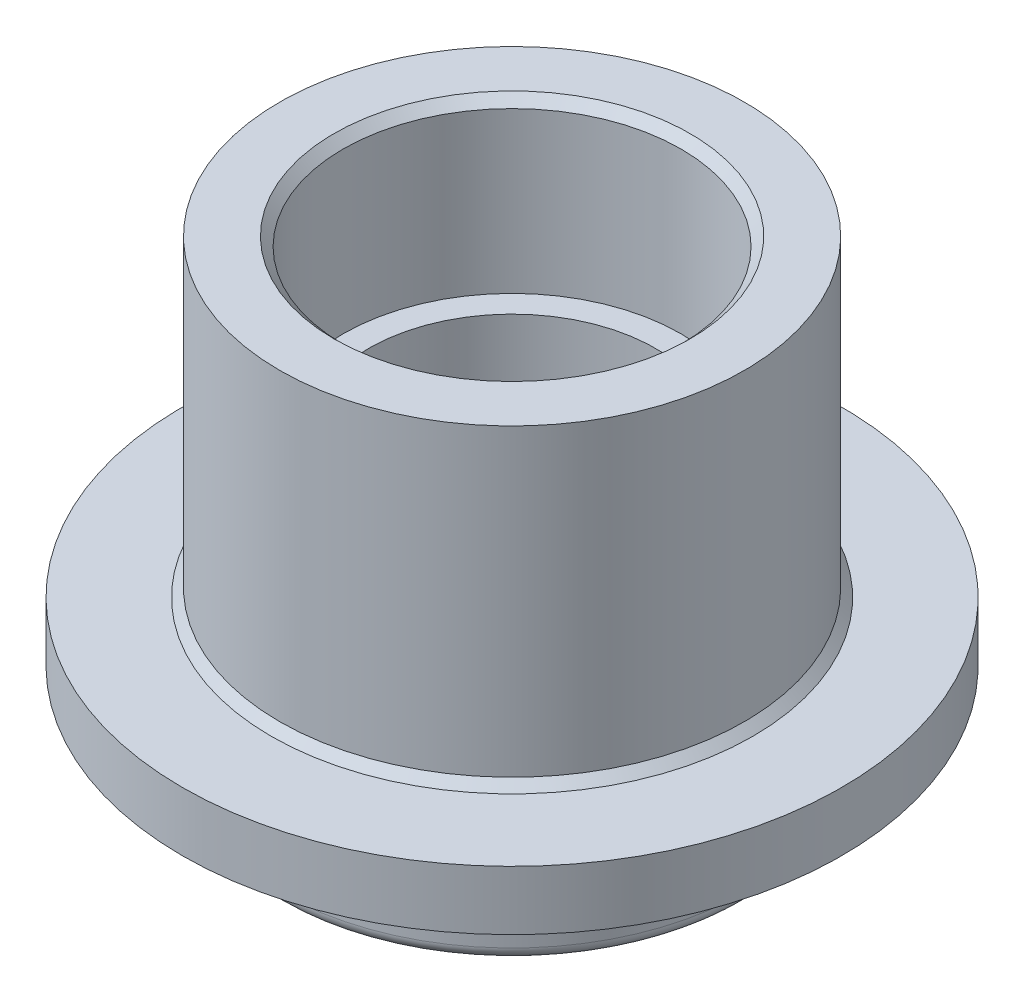
ISO-10303-21;
HEADER;
FILE_DESCRIPTION(('STEP AP214'),'2;1');
FILE_NAME('part.step','',(''),(''),'','','');
FILE_SCHEMA(('AUTOMOTIVE_DESIGN { 1 0 10303 214 1 1 1 1 }'));
ENDSEC;
DATA;
#1=APPLICATION_CONTEXT('core data for automotive mechanical design processes');
#2=APPLICATION_PROTOCOL_DEFINITION('international standard','automotive_design',2000,#1);
#3=PRODUCT_CONTEXT('',#1,'mechanical');
#4=PRODUCT('Part','Part','',(#3));
#5=PRODUCT_RELATED_PRODUCT_CATEGORY('part','',(#4));
#6=PRODUCT_DEFINITION_FORMATION('','',#4);
#7=PRODUCT_DEFINITION_CONTEXT('part definition',#1,'design');
#8=PRODUCT_DEFINITION('design','',#6,#7);
#9=PRODUCT_DEFINITION_SHAPE('','',#8);
#10=(LENGTH_UNIT() NAMED_UNIT(*) SI_UNIT(.MILLI.,.METRE.));
#11=(NAMED_UNIT(*) PLANE_ANGLE_UNIT() SI_UNIT($,.RADIAN.));
#12=(NAMED_UNIT(*) SI_UNIT($,.STERADIAN.) SOLID_ANGLE_UNIT());
#13=UNCERTAINTY_MEASURE_WITH_UNIT(LENGTH_MEASURE(1.E-05),#10,'distance_accuracy_value','');
#14=(GEOMETRIC_REPRESENTATION_CONTEXT(3) GLOBAL_UNCERTAINTY_ASSIGNED_CONTEXT((#13)) GLOBAL_UNIT_ASSIGNED_CONTEXT((#10,
#11,#12)) REPRESENTATION_CONTEXT('',''));
#15=CARTESIAN_POINT('',(0.,0.,0.));
#16=DIRECTION('',(0.,0.,1.));
#17=DIRECTION('',(1.,0.,0.));
#18=AXIS2_PLACEMENT_3D('',#15,#16,#17);
#19=CARTESIAN_POINT('',(0.,-180.,0.));
#20=DIRECTION('',(0.,1.,0.));
#21=DIRECTION('',(0.,0.,1.));
#22=AXIS2_PLACEMENT_3D('',#19,#20,#21);
#23=PLANE('',#22);
#24=CARTESIAN_POINT('',(0.,-180.,0.));
#25=DIRECTION('',(0.,1.,0.));
#26=DIRECTION('',(0.,0.,1.));
#27=AXIS2_PLACEMENT_3D('',#24,#25,#26);
#28=CIRCLE('',#27,260.);
#29=CARTESIAN_POINT('',(0.,-180.,260.));
#30=VERTEX_POINT('',#29);
#31=EDGE_CURVE('E10',#30,#30,#28,.T.);
#32=ORIENTED_EDGE('',*,*,#31,.F.);
#33=EDGE_LOOP('',(#32));
#34=FACE_BOUND('',#33,.T.);
#35=CARTESIAN_POINT('',(0.,-180.,0.));
#36=DIRECTION('',(0.,1.,0.));
#37=DIRECTION('',(0.,0.,1.));
#38=AXIS2_PLACEMENT_3D('',#35,#36,#37);
#39=CIRCLE('',#38,200.);
#40=CARTESIAN_POINT('',(0.,-180.,200.));
#41=VERTEX_POINT('',#40);
#42=EDGE_CURVE('E85',#41,#41,#39,.T.);
#43=ORIENTED_EDGE('',*,*,#42,.T.);
#44=EDGE_LOOP('',(#43));
#45=FACE_BOUND('',#44,.T.);
#46=ADVANCED_FACE('F36',(#34,#45),#23,.F.);
#47=CARTESIAN_POINT('',(0.,-165.,0.));
#48=DIRECTION('',(0.,1.,0.));
#49=DIRECTION('',(0.,0.,1.));
#50=AXIS2_PLACEMENT_3D('',#47,#48,#49);
#51=TOROIDAL_SURFACE('',#50,260.,15.);
#52=CARTESIAN_POINT('',(0.,-165.,0.));
#53=DIRECTION('',(0.,1.,0.));
#54=DIRECTION('',(0.,0.,1.));
#55=AXIS2_PLACEMENT_3D('',#52,#53,#54);
#56=CIRCLE('',#55,275.);
#57=CARTESIAN_POINT('',(0.,-165.,275.));
#58=VERTEX_POINT('',#57);
#59=EDGE_CURVE('E42',#58,#58,#56,.T.);
#60=ORIENTED_EDGE('',*,*,#59,.F.);
#61=EDGE_LOOP('',(#60));
#62=FACE_BOUND('',#61,.T.);
#63=ORIENTED_EDGE('',*,*,#31,.T.);
#64=EDGE_LOOP('',(#63));
#65=FACE_BOUND('',#64,.T.);
#66=ADVANCED_FACE('F102',(#62,#65),#51,.T.);
#67=CARTESIAN_POINT('',(0.,425.243902439025,0.));
#68=DIRECTION('',(0.,1.,0.));
#69=DIRECTION('',(0.,0.,1.));
#70=AXIS2_PLACEMENT_3D('',#67,#68,#69);
#71=CYLINDRICAL_SURFACE('',#70,275.);
#72=CARTESIAN_POINT('',(0.,-70.,0.));
#73=DIRECTION('',(0.,1.,0.));
#74=DIRECTION('',(0.,0.,1.));
#75=AXIS2_PLACEMENT_3D('',#72,#73,#74);
#76=CIRCLE('',#75,275.);
#77=CARTESIAN_POINT('',(0.,-70.,275.));
#78=VERTEX_POINT('',#77);
#79=EDGE_CURVE('E46',#78,#78,#76,.T.);
#80=ORIENTED_EDGE('',*,*,#79,.F.);
#81=EDGE_LOOP('',(#80));
#82=FACE_BOUND('',#81,.T.);
#83=ORIENTED_EDGE('',*,*,#59,.T.);
#84=EDGE_LOOP('',(#83));
#85=FACE_BOUND('',#84,.T.);
#86=ADVANCED_FACE('F107',(#82,#85),#71,.T.);
#87=CARTESIAN_POINT('',(0.,-70.,0.));
#88=DIRECTION('',(0.,1.,0.));
#89=DIRECTION('',(0.,0.,1.));
#90=AXIS2_PLACEMENT_3D('',#87,#88,#89);
#91=PLANE('',#90);
#92=CARTESIAN_POINT('',(0.,-70.,0.));
#93=DIRECTION('',(0.,1.,0.));
#94=DIRECTION('',(0.,0.,1.));
#95=AXIS2_PLACEMENT_3D('',#92,#93,#94);
#96=CIRCLE('',#95,390.);
#97=CARTESIAN_POINT('',(0.,-70.,390.));
#98=VERTEX_POINT('',#97);
#99=EDGE_CURVE('E50',#98,#98,#96,.T.);
#100=ORIENTED_EDGE('',*,*,#99,.F.);
#101=EDGE_LOOP('',(#100));
#102=FACE_BOUND('',#101,.T.);
#103=ORIENTED_EDGE('',*,*,#79,.T.);
#104=EDGE_LOOP('',(#103));
#105=FACE_BOUND('',#104,.T.);
#106=ADVANCED_FACE('F112',(#102,#105),#91,.F.);
#107=CARTESIAN_POINT('',(0.,425.243902439025,0.));
#108=DIRECTION('',(0.,1.,0.));
#109=DIRECTION('',(0.,0.,1.));
#110=AXIS2_PLACEMENT_3D('',#107,#108,#109);
#111=CYLINDRICAL_SURFACE('',#110,390.);
#112=CARTESIAN_POINT('',(0.,0.,0.));
#113=DIRECTION('',(0.,1.,0.));
#114=DIRECTION('',(0.,0.,1.));
#115=AXIS2_PLACEMENT_3D('',#112,#113,#114);
#116=CIRCLE('',#115,390.);
#117=CARTESIAN_POINT('',(0.,0.,390.));
#118=VERTEX_POINT('',#117);
#119=EDGE_CURVE('E55',#118,#118,#116,.T.);
#120=ORIENTED_EDGE('',*,*,#119,.F.);
#121=EDGE_LOOP('',(#120));
#122=FACE_BOUND('',#121,.T.);
#123=ORIENTED_EDGE('',*,*,#99,.T.);
#124=EDGE_LOOP('',(#123));
#125=FACE_BOUND('',#124,.T.);
#126=ADVANCED_FACE('F118',(#122,#125),#111,.T.);
#127=CARTESIAN_POINT('',(0.,0.,0.));
#128=DIRECTION('',(0.,-1.,0.));
#129=DIRECTION('',(0.,0.,-1.));
#130=AXIS2_PLACEMENT_3D('',#127,#128,#129);
#131=PLANE('',#130);
#132=CARTESIAN_POINT('',(0.,0.,0.));
#133=DIRECTION('',(0.,1.,0.));
#134=DIRECTION('',(0.,0.,1.));
#135=AXIS2_PLACEMENT_3D('',#132,#133,#134);
#136=CIRCLE('',#135,285.);
#137=CARTESIAN_POINT('',(0.,0.,285.));
#138=VERTEX_POINT('',#137);
#139=EDGE_CURVE('E58',#138,#138,#136,.T.);
#140=ORIENTED_EDGE('',*,*,#139,.F.);
#141=EDGE_LOOP('',(#140));
#142=FACE_BOUND('',#141,.T.);
#143=ORIENTED_EDGE('',*,*,#119,.T.);
#144=EDGE_LOOP('',(#143));
#145=FACE_BOUND('',#144,.T.);
#146=ADVANCED_FACE('F122',(#142,#145),#131,.F.);
#147=CARTESIAN_POINT('',(0.,0.,0.));
#148=DIRECTION('',(0.,-1.,0.));
#149=DIRECTION('',(0.,0.,-1.));
#150=AXIS2_PLACEMENT_3D('',#147,#148,#149);
#151=CONICAL_SURFACE('',#150,285.,0.785398163397454);
#152=CARTESIAN_POINT('',(0.,9.99999999999995,0.));
#153=DIRECTION('',(0.,1.,0.));
#154=DIRECTION('',(0.,0.,1.));
#155=AXIS2_PLACEMENT_3D('',#152,#153,#154);
#156=CIRCLE('',#155,275.);
#157=CARTESIAN_POINT('',(0.,9.99999999999995,275.));
#158=VERTEX_POINT('',#157);
#159=EDGE_CURVE('E61',#158,#158,#156,.T.);
#160=ORIENTED_EDGE('',*,*,#159,.F.);
#161=EDGE_LOOP('',(#160));
#162=FACE_BOUND('',#161,.T.);
#163=ORIENTED_EDGE('',*,*,#139,.T.);
#164=EDGE_LOOP('',(#163));
#165=FACE_BOUND('',#164,.T.);
#166=ADVANCED_FACE('F126',(#162,#165),#151,.T.);
#167=CARTESIAN_POINT('',(0.,425.243902439025,0.));
#168=DIRECTION('',(0.,1.,0.));
#169=DIRECTION('',(0.,0.,1.));
#170=AXIS2_PLACEMENT_3D('',#167,#168,#169);
#171=CYLINDRICAL_SURFACE('',#170,275.);
#172=CARTESIAN_POINT('',(0.,370.,0.));
#173=DIRECTION('',(0.,1.,0.));
#174=DIRECTION('',(0.,0.,1.));
#175=AXIS2_PLACEMENT_3D('',#172,#173,#174);
#176=CIRCLE('',#175,275.);
#177=CARTESIAN_POINT('',(0.,370.,275.));
#178=VERTEX_POINT('',#177);
#179=EDGE_CURVE('E64',#178,#178,#176,.T.);
#180=ORIENTED_EDGE('',*,*,#179,.F.);
#181=EDGE_LOOP('',(#180));
#182=FACE_BOUND('',#181,.T.);
#183=ORIENTED_EDGE('',*,*,#159,.T.);
#184=EDGE_LOOP('',(#183));
#185=FACE_BOUND('',#184,.T.);
#186=ADVANCED_FACE('F130',(#182,#185),#171,.T.);
#187=CARTESIAN_POINT('',(0.,370.,0.));
#188=DIRECTION('',(0.,-1.,0.));
#189=DIRECTION('',(0.,0.,-1.));
#190=AXIS2_PLACEMENT_3D('',#187,#188,#189);
#191=PLANE('',#190);
#192=CARTESIAN_POINT('',(0.,370.,0.));
#193=DIRECTION('',(0.,1.,0.));
#194=DIRECTION('',(0.,0.,1.));
#195=AXIS2_PLACEMENT_3D('',#192,#193,#194);
#196=CIRCLE('',#195,210.606601717798);
#197=CARTESIAN_POINT('',(0.,370.,210.606601717798));
#198=VERTEX_POINT('',#197);
#199=EDGE_CURVE('E67',#198,#198,#196,.T.);
#200=ORIENTED_EDGE('',*,*,#199,.F.);
#201=EDGE_LOOP('',(#200));
#202=FACE_BOUND('',#201,.T.);
#203=ORIENTED_EDGE('',*,*,#179,.T.);
#204=EDGE_LOOP('',(#203));
#205=FACE_BOUND('',#204,.T.);
#206=ADVANCED_FACE('F134',(#202,#205),#191,.F.);
#207=CARTESIAN_POINT('',(0.,359.393398282202,0.));
#208=DIRECTION('',(0.,1.,0.));
#209=DIRECTION('',(0.,0.,1.));
#210=AXIS2_PLACEMENT_3D('',#207,#208,#209);
#211=CONICAL_SURFACE('',#210,200.,0.785398163397461);
#212=ORIENTED_EDGE('',*,*,#199,.T.);
#213=EDGE_LOOP('',(#212));
#214=FACE_BOUND('',#213,.T.);
#215=CARTESIAN_POINT('',(0.,359.393398282202,0.));
#216=DIRECTION('',(0.,1.,0.));
#217=DIRECTION('',(0.,0.,1.));
#218=AXIS2_PLACEMENT_3D('',#215,#216,#217);
#219=CIRCLE('',#218,200.);
#220=CARTESIAN_POINT('',(0.,359.393398282202,200.));
#221=VERTEX_POINT('',#220);
#222=EDGE_CURVE('E70',#221,#221,#219,.T.);
#223=ORIENTED_EDGE('',*,*,#222,.F.);
#224=EDGE_LOOP('',(#223));
#225=FACE_BOUND('',#224,.T.);
#226=ADVANCED_FACE('F138',(#214,#225),#211,.F.);
#227=CARTESIAN_POINT('',(0.,425.243902439025,0.));
#228=DIRECTION('',(0.,1.,0.));
#229=DIRECTION('',(0.,0.,1.));
#230=AXIS2_PLACEMENT_3D('',#227,#228,#229);
#231=CYLINDRICAL_SURFACE('',#230,200.);
#232=ORIENTED_EDGE('',*,*,#222,.T.);
#233=EDGE_LOOP('',(#232));
#234=FACE_BOUND('',#233,.T.);
#235=CARTESIAN_POINT('',(0.,170.,0.));
#236=DIRECTION('',(0.,1.,0.));
#237=DIRECTION('',(0.,0.,1.));
#238=AXIS2_PLACEMENT_3D('',#235,#236,#237);
#239=CIRCLE('',#238,200.);
#240=CARTESIAN_POINT('',(0.,170.,200.));
#241=VERTEX_POINT('',#240);
#242=EDGE_CURVE('E73',#241,#241,#239,.T.);
#243=ORIENTED_EDGE('',*,*,#242,.F.);
#244=EDGE_LOOP('',(#243));
#245=FACE_BOUND('',#244,.T.);
#246=ADVANCED_FACE('F142',(#234,#245),#231,.F.);
#247=CARTESIAN_POINT('',(0.,170.,0.));
#248=DIRECTION('',(0.,-1.,0.));
#249=DIRECTION('',(0.,0.,-1.));
#250=AXIS2_PLACEMENT_3D('',#247,#248,#249);
#251=PLANE('',#250);
#252=CARTESIAN_POINT('',(0.,170.,0.));
#253=DIRECTION('',(0.,1.,0.));
#254=DIRECTION('',(0.,0.,1.));
#255=AXIS2_PLACEMENT_3D('',#252,#253,#254);
#256=CIRCLE('',#255,170.);
#257=CARTESIAN_POINT('',(0.,170.,170.));
#258=VERTEX_POINT('',#257);
#259=EDGE_CURVE('E76',#258,#258,#256,.T.);
#260=ORIENTED_EDGE('',*,*,#259,.F.);
#261=EDGE_LOOP('',(#260));
#262=FACE_BOUND('',#261,.T.);
#263=ORIENTED_EDGE('',*,*,#242,.T.);
#264=EDGE_LOOP('',(#263));
#265=FACE_BOUND('',#264,.T.);
#266=ADVANCED_FACE('F146',(#262,#265),#251,.F.);
#267=CARTESIAN_POINT('',(0.,425.243902439025,0.));
#268=DIRECTION('',(0.,1.,0.));
#269=DIRECTION('',(0.,0.,1.));
#270=AXIS2_PLACEMENT_3D('',#267,#268,#269);
#271=CYLINDRICAL_SURFACE('',#270,170.);
#272=ORIENTED_EDGE('',*,*,#259,.T.);
#273=EDGE_LOOP('',(#272));
#274=FACE_BOUND('',#273,.T.);
#275=CARTESIAN_POINT('',(0.,-60.0000000000001,0.));
#276=DIRECTION('',(0.,1.,0.));
#277=DIRECTION('',(0.,0.,1.));
#278=AXIS2_PLACEMENT_3D('',#275,#276,#277);
#279=CIRCLE('',#278,170.);
#280=CARTESIAN_POINT('',(0.,-60.0000000000001,170.));
#281=VERTEX_POINT('',#280);
#282=EDGE_CURVE('E79',#281,#281,#279,.T.);
#283=ORIENTED_EDGE('',*,*,#282,.F.);
#284=EDGE_LOOP('',(#283));
#285=FACE_BOUND('',#284,.T.);
#286=ADVANCED_FACE('F98',(#274,#285),#271,.F.);
#287=CARTESIAN_POINT('',(0.,-60.0000000000001,0.));
#288=DIRECTION('',(0.,-1.,0.));
#289=DIRECTION('',(0.,0.,-1.));
#290=AXIS2_PLACEMENT_3D('',#287,#288,#289);
#291=PLANE('',#290);
#292=ORIENTED_EDGE('',*,*,#282,.T.);
#293=EDGE_LOOP('',(#292));
#294=FACE_BOUND('',#293,.T.);
#295=CARTESIAN_POINT('',(0.,-60.0000000000001,0.));
#296=DIRECTION('',(0.,1.,0.));
#297=DIRECTION('',(0.,0.,1.));
#298=AXIS2_PLACEMENT_3D('',#295,#296,#297);
#299=CIRCLE('',#298,200.);
#300=CARTESIAN_POINT('',(0.,-60.0000000000001,200.));
#301=VERTEX_POINT('',#300);
#302=EDGE_CURVE('E82',#301,#301,#299,.T.);
#303=ORIENTED_EDGE('',*,*,#302,.F.);
#304=EDGE_LOOP('',(#303));
#305=FACE_BOUND('',#304,.T.);
#306=ADVANCED_FACE('F92',(#294,#305),#291,.T.);
#307=CARTESIAN_POINT('',(0.,425.243902439025,0.));
#308=DIRECTION('',(0.,1.,0.));
#309=DIRECTION('',(0.,0.,1.));
#310=AXIS2_PLACEMENT_3D('',#307,#308,#309);
#311=CYLINDRICAL_SURFACE('',#310,200.);
#312=ORIENTED_EDGE('',*,*,#302,.T.);
#313=EDGE_LOOP('',(#312));
#314=FACE_BOUND('',#313,.T.);
#315=ORIENTED_EDGE('',*,*,#42,.F.);
#316=EDGE_LOOP('',(#315));
#317=FACE_BOUND('',#316,.T.);
#318=ADVANCED_FACE('F90',(#314,#317),#311,.F.);
#319=CLOSED_SHELL('',(#46,#66,#86,#106,#126,#146,#166,#186,#206,#226,#246,#266,#286,#306,#318));
#320=MANIFOLD_SOLID_BREP('B2',#319);
#321=ADVANCED_BREP_SHAPE_REPRESENTATION('',(#18,#320),#14);
#322=SHAPE_DEFINITION_REPRESENTATION(#9,#321);
ENDSEC;
END-ISO-10303-21;
